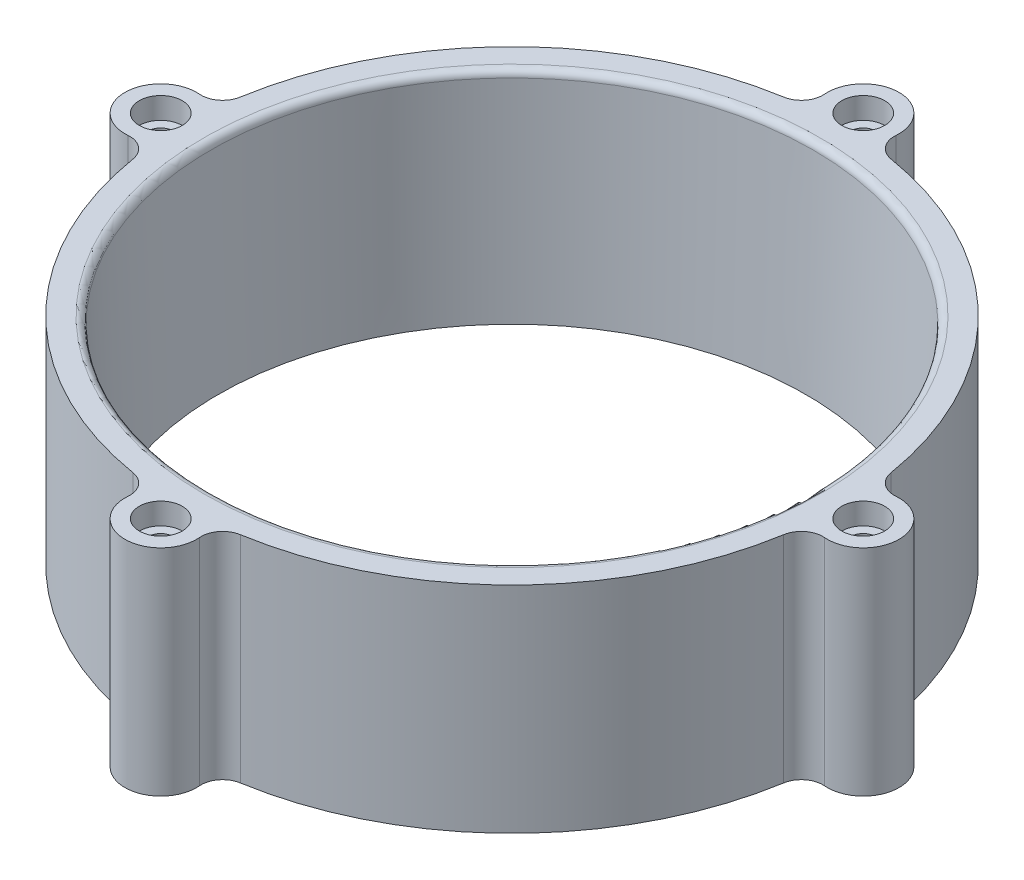
ISO-10303-21;
HEADER;
FILE_DESCRIPTION(('STEP AP214'),'2;1');
FILE_NAME('part.step','',(''),(''),'','','');
FILE_SCHEMA(('AUTOMOTIVE_DESIGN { 1 0 10303 214 1 1 1 1 }'));
ENDSEC;
DATA;
#1=APPLICATION_CONTEXT('core data for automotive mechanical design processes');
#2=APPLICATION_PROTOCOL_DEFINITION('international standard','automotive_design',2000,#1);
#3=PRODUCT_CONTEXT('',#1,'mechanical');
#4=PRODUCT('Part','Part','',(#3));
#5=PRODUCT_RELATED_PRODUCT_CATEGORY('part','',(#4));
#6=PRODUCT_DEFINITION_FORMATION('','',#4);
#7=PRODUCT_DEFINITION_CONTEXT('part definition',#1,'design');
#8=PRODUCT_DEFINITION('design','',#6,#7);
#9=PRODUCT_DEFINITION_SHAPE('','',#8);
#10=(LENGTH_UNIT() NAMED_UNIT(*) SI_UNIT(.MILLI.,.METRE.));
#11=(NAMED_UNIT(*) PLANE_ANGLE_UNIT() SI_UNIT($,.RADIAN.));
#12=(NAMED_UNIT(*) SI_UNIT($,.STERADIAN.) SOLID_ANGLE_UNIT());
#13=UNCERTAINTY_MEASURE_WITH_UNIT(LENGTH_MEASURE(1.E-05),#10,'distance_accuracy_value','');
#14=(GEOMETRIC_REPRESENTATION_CONTEXT(3) GLOBAL_UNCERTAINTY_ASSIGNED_CONTEXT((#13)) GLOBAL_UNIT_ASSIGNED_CONTEXT((#10,
#11,#12)) REPRESENTATION_CONTEXT('',''));
#15=CARTESIAN_POINT('',(0.,0.,0.));
#16=DIRECTION('',(0.,0.,1.));
#17=DIRECTION('',(1.,0.,0.));
#18=AXIS2_PLACEMENT_3D('',#15,#16,#17);
#19=CARTESIAN_POINT('',(0.,30.,-49.));
#20=DIRECTION('',(0.,-1.,0.));
#21=DIRECTION('',(0.,0.,-1.));
#22=AXIS2_PLACEMENT_3D('',#19,#20,#21);
#23=CYLINDRICAL_SURFACE('',#22,1.7);
#24=CARTESIAN_POINT('',(0.,0.,-49.));
#25=DIRECTION('',(0.,1.,0.));
#26=DIRECTION('',(0.,0.,1.));
#27=AXIS2_PLACEMENT_3D('',#24,#25,#26);
#28=CIRCLE('',#27,1.7);
#29=CARTESIAN_POINT('',(0.,0.,-47.3));
#30=VERTEX_POINT('',#29);
#31=EDGE_CURVE('E630',#30,#30,#28,.T.);
#32=ORIENTED_EDGE('',*,*,#31,.F.);
#33=EDGE_LOOP('',(#32));
#34=FACE_BOUND('',#33,.T.);
#35=CARTESIAN_POINT('',(0.,27.,-49.));
#36=DIRECTION('',(0.,1.,0.));
#37=DIRECTION('',(0.,0.,1.));
#38=AXIS2_PLACEMENT_3D('',#35,#36,#37);
#39=CIRCLE('',#38,1.7);
#40=CARTESIAN_POINT('',(0.,27.,-47.3));
#41=VERTEX_POINT('',#40);
#42=EDGE_CURVE('E268',#41,#41,#39,.T.);
#43=ORIENTED_EDGE('',*,*,#42,.T.);
#44=EDGE_LOOP('',(#43));
#45=FACE_BOUND('',#44,.T.);
#46=ADVANCED_FACE('F44',(#34,#45),#23,.F.);
#47=CARTESIAN_POINT('',(49.,30.,0.));
#48=DIRECTION('',(0.,-1.,0.));
#49=DIRECTION('',(0.,0.,-1.));
#50=AXIS2_PLACEMENT_3D('',#47,#48,#49);
#51=CYLINDRICAL_SURFACE('',#50,1.7);
#52=CARTESIAN_POINT('',(49.,0.,0.));
#53=DIRECTION('',(0.,1.,0.));
#54=DIRECTION('',(0.,0.,1.));
#55=AXIS2_PLACEMENT_3D('',#52,#53,#54);
#56=CIRCLE('',#55,1.7);
#57=CARTESIAN_POINT('',(49.,0.,1.70000000000002));
#58=VERTEX_POINT('',#57);
#59=EDGE_CURVE('E624',#58,#58,#56,.T.);
#60=ORIENTED_EDGE('',*,*,#59,.F.);
#61=EDGE_LOOP('',(#60));
#62=FACE_BOUND('',#61,.T.);
#63=CARTESIAN_POINT('',(49.,27.,0.));
#64=DIRECTION('',(0.,1.,0.));
#65=DIRECTION('',(0.,0.,1.));
#66=AXIS2_PLACEMENT_3D('',#63,#64,#65);
#67=CIRCLE('',#66,1.7);
#68=CARTESIAN_POINT('',(49.,27.,1.70000000000002));
#69=VERTEX_POINT('',#68);
#70=EDGE_CURVE('E266',#69,#69,#67,.T.);
#71=ORIENTED_EDGE('',*,*,#70,.T.);
#72=EDGE_LOOP('',(#71));
#73=FACE_BOUND('',#72,.T.);
#74=ADVANCED_FACE('F289',(#62,#73),#51,.F.);
#75=CARTESIAN_POINT('',(0.,30.,49.));
#76=DIRECTION('',(0.,-1.,0.));
#77=DIRECTION('',(0.,0.,-1.));
#78=AXIS2_PLACEMENT_3D('',#75,#76,#77);
#79=CYLINDRICAL_SURFACE('',#78,1.7);
#80=CARTESIAN_POINT('',(0.,0.,49.));
#81=DIRECTION('',(0.,1.,0.));
#82=DIRECTION('',(0.,0.,1.));
#83=AXIS2_PLACEMENT_3D('',#80,#81,#82);
#84=CIRCLE('',#83,1.7);
#85=CARTESIAN_POINT('',(0.,0.,50.7));
#86=VERTEX_POINT('',#85);
#87=EDGE_CURVE('E599',#86,#86,#84,.T.);
#88=ORIENTED_EDGE('',*,*,#87,.F.);
#89=EDGE_LOOP('',(#88));
#90=FACE_BOUND('',#89,.T.);
#91=CARTESIAN_POINT('',(0.,27.,49.));
#92=DIRECTION('',(0.,1.,0.));
#93=DIRECTION('',(0.,0.,1.));
#94=AXIS2_PLACEMENT_3D('',#91,#92,#93);
#95=CIRCLE('',#94,1.7);
#96=CARTESIAN_POINT('',(0.,27.,50.7));
#97=VERTEX_POINT('',#96);
#98=EDGE_CURVE('E264',#97,#97,#95,.T.);
#99=ORIENTED_EDGE('',*,*,#98,.T.);
#100=EDGE_LOOP('',(#99));
#101=FACE_BOUND('',#100,.T.);
#102=ADVANCED_FACE('F298',(#90,#101),#79,.F.);
#103=CARTESIAN_POINT('',(-49.,30.,0.));
#104=DIRECTION('',(0.,-1.,0.));
#105=DIRECTION('',(0.,0.,-1.));
#106=AXIS2_PLACEMENT_3D('',#103,#104,#105);
#107=CYLINDRICAL_SURFACE('',#106,1.7);
#108=CARTESIAN_POINT('',(-49.,0.,0.));
#109=DIRECTION('',(0.,1.,0.));
#110=DIRECTION('',(0.,0.,1.));
#111=AXIS2_PLACEMENT_3D('',#108,#109,#110);
#112=CIRCLE('',#111,1.7);
#113=CARTESIAN_POINT('',(-49.,0.,1.7));
#114=VERTEX_POINT('',#113);
#115=EDGE_CURVE('E619',#114,#114,#112,.T.);
#116=ORIENTED_EDGE('',*,*,#115,.F.);
#117=EDGE_LOOP('',(#116));
#118=FACE_BOUND('',#117,.T.);
#119=CARTESIAN_POINT('',(-49.,27.,0.));
#120=DIRECTION('',(0.,1.,0.));
#121=DIRECTION('',(0.,0.,1.));
#122=AXIS2_PLACEMENT_3D('',#119,#120,#121);
#123=CIRCLE('',#122,1.7);
#124=CARTESIAN_POINT('',(-49.,27.,1.7));
#125=VERTEX_POINT('',#124);
#126=EDGE_CURVE('E260',#125,#125,#123,.T.);
#127=ORIENTED_EDGE('',*,*,#126,.T.);
#128=EDGE_LOOP('',(#127));
#129=FACE_BOUND('',#128,.T.);
#130=ADVANCED_FACE('F306',(#118,#129),#107,.F.);
#131=CARTESIAN_POINT('',(0.,30.,24.5));
#132=DIRECTION('',(0.,1.,0.));
#133=DIRECTION('',(0.,0.,1.));
#134=AXIS2_PLACEMENT_3D('',#131,#132,#133);
#135=PLANE('',#134);
#136=CARTESIAN_POINT('',(0.,30.,0.));
#137=DIRECTION('',(0.,1.,0.));
#138=DIRECTION('',(0.,0.,1.));
#139=AXIS2_PLACEMENT_3D('',#136,#137,#138);
#140=CIRCLE('',#139,43.0133118595595);
#141=CARTESIAN_POINT('',(0.,30.,43.0133118595595));
#142=VERTEX_POINT('',#141);
#143=EDGE_CURVE('E11',#142,#142,#140,.F.);
#144=ORIENTED_EDGE('',*,*,#143,.T.);
#145=EDGE_LOOP('',(#144));
#146=FACE_BOUND('',#145,.T.);
#147=CARTESIAN_POINT('',(0.,30.,-49.));
#148=DIRECTION('',(0.,1.,0.));
#149=DIRECTION('',(0.,0.,1.));
#150=AXIS2_PLACEMENT_3D('',#147,#148,#149);
#151=CIRCLE('',#150,3.);
#152=CARTESIAN_POINT('',(0.,30.,-46.));
#153=VERTEX_POINT('',#152);
#154=EDGE_CURVE('E701',#153,#153,#151,.T.);
#155=ORIENTED_EDGE('',*,*,#154,.F.);
#156=EDGE_LOOP('',(#155));
#157=FACE_BOUND('',#156,.T.);
#158=CARTESIAN_POINT('',(-49.,30.,0.));
#159=DIRECTION('',(0.,1.,0.));
#160=DIRECTION('',(0.,0.,1.));
#161=AXIS2_PLACEMENT_3D('',#158,#159,#160);
#162=CIRCLE('',#161,3.);
#163=CARTESIAN_POINT('',(-49.,30.,3.));
#164=VERTEX_POINT('',#163);
#165=EDGE_CURVE('E697',#164,#164,#162,.T.);
#166=ORIENTED_EDGE('',*,*,#165,.F.);
#167=EDGE_LOOP('',(#166));
#168=FACE_BOUND('',#167,.T.);
#169=CARTESIAN_POINT('',(0.,30.,49.));
#170=DIRECTION('',(0.,1.,0.));
#171=DIRECTION('',(0.,0.,1.));
#172=AXIS2_PLACEMENT_3D('',#169,#170,#171);
#173=CIRCLE('',#172,3.);
#174=CARTESIAN_POINT('',(0.,30.,52.));
#175=VERTEX_POINT('',#174);
#176=EDGE_CURVE('E601',#175,#175,#173,.T.);
#177=ORIENTED_EDGE('',*,*,#176,.F.);
#178=EDGE_LOOP('',(#177));
#179=FACE_BOUND('',#178,.T.);
#180=CARTESIAN_POINT('',(49.,30.,0.));
#181=DIRECTION('',(0.,1.,0.));
#182=DIRECTION('',(0.,0.,1.));
#183=AXIS2_PLACEMENT_3D('',#180,#181,#182);
#184=CIRCLE('',#183,3.);
#185=CARTESIAN_POINT('',(49.,30.,3.00000000000002));
#186=VERTEX_POINT('',#185);
#187=EDGE_CURVE('E607',#186,#186,#184,.T.);
#188=ORIENTED_EDGE('',*,*,#187,.F.);
#189=EDGE_LOOP('',(#188));
#190=FACE_BOUND('',#189,.T.);
#191=CARTESIAN_POINT('',(-49.,30.,0.));
#192=DIRECTION('',(0.,1.,0.));
#193=DIRECTION('',(0.,0.,1.));
#194=AXIS2_PLACEMENT_3D('',#191,#192,#193);
#195=CIRCLE('',#194,5.);
#196=CARTESIAN_POINT('',(-48.5918367346939,30.,-4.98331242737746));
#197=VERTEX_POINT('',#196);
#198=CARTESIAN_POINT('',(-48.5918367346939,30.,4.98331242737746));
#199=VERTEX_POINT('',#198);
#200=EDGE_CURVE('E200',#197,#199,#195,.T.);
#201=ORIENTED_EDGE('',*,*,#200,.T.);
#202=CARTESIAN_POINT('',(-48.3469387755102,30.,7.97329988380398));
#203=DIRECTION('',(0.,1.,0.));
#204=DIRECTION('',(0.,0.,1.));
#205=AXIS2_PLACEMENT_3D('',#202,#203,#204);
#206=CIRCLE('',#205,3.);
#207=CARTESIAN_POINT('',(-45.3869221157851,30.,7.48513866642822));
#208=VERTEX_POINT('',#207);
#209=EDGE_CURVE('E232',#199,#208,#206,.F.);
#210=ORIENTED_EDGE('',*,*,#209,.T.);
#211=CARTESIAN_POINT('',(0.,30.,0.));
#212=DIRECTION('',(0.,1.,0.));
#213=DIRECTION('',(0.,0.,1.));
#214=AXIS2_PLACEMENT_3D('',#211,#212,#213);
#215=CIRCLE('',#214,46.);
#216=CARTESIAN_POINT('',(-7.48513866642817,30.,45.3869221157851));
#217=VERTEX_POINT('',#216);
#218=EDGE_CURVE('E194',#208,#217,#215,.T.);
#219=ORIENTED_EDGE('',*,*,#218,.T.);
#220=CARTESIAN_POINT('',(-7.97329988380392,30.,48.3469387755102));
#221=DIRECTION('',(0.,1.,0.));
#222=DIRECTION('',(0.,0.,1.));
#223=AXIS2_PLACEMENT_3D('',#220,#221,#222);
#224=CIRCLE('',#223,3.);
#225=CARTESIAN_POINT('',(-4.98331242737744,30.,48.5918367346939));
#226=VERTEX_POINT('',#225);
#227=EDGE_CURVE('E69',#217,#226,#224,.F.);
#228=ORIENTED_EDGE('',*,*,#227,.T.);
#229=CARTESIAN_POINT('',(0.,30.,49.));
#230=DIRECTION('',(0.,1.,0.));
#231=DIRECTION('',(0.,0.,1.));
#232=AXIS2_PLACEMENT_3D('',#229,#230,#231);
#233=CIRCLE('',#232,5.);
#234=CARTESIAN_POINT('',(4.98331242737748,30.,48.5918367346939));
#235=VERTEX_POINT('',#234);
#236=EDGE_CURVE('E635',#226,#235,#233,.T.);
#237=ORIENTED_EDGE('',*,*,#236,.T.);
#238=CARTESIAN_POINT('',(7.97329988380399,30.,48.3469387755102));
#239=DIRECTION('',(0.,1.,0.));
#240=DIRECTION('',(0.,0.,1.));
#241=AXIS2_PLACEMENT_3D('',#238,#239,#240);
#242=CIRCLE('',#241,3.);
#243=CARTESIAN_POINT('',(7.48513866642824,30.,45.3869221157851));
#244=VERTEX_POINT('',#243);
#245=EDGE_CURVE('E251',#235,#244,#242,.F.);
#246=ORIENTED_EDGE('',*,*,#245,.T.);
#247=CARTESIAN_POINT('',(0.,30.,0.));
#248=DIRECTION('',(0.,1.,0.));
#249=DIRECTION('',(0.,0.,1.));
#250=AXIS2_PLACEMENT_3D('',#247,#248,#249);
#251=CIRCLE('',#250,46.);
#252=CARTESIAN_POINT('',(45.3869221157851,30.,7.4851386664282));
#253=VERTEX_POINT('',#252);
#254=EDGE_CURVE('E632',#244,#253,#251,.T.);
#255=ORIENTED_EDGE('',*,*,#254,.T.);
#256=CARTESIAN_POINT('',(48.3469387755102,30.,7.97329988380396));
#257=DIRECTION('',(0.,1.,0.));
#258=DIRECTION('',(0.,0.,1.));
#259=AXIS2_PLACEMENT_3D('',#256,#257,#258);
#260=CIRCLE('',#259,3.);
#261=CARTESIAN_POINT('',(48.5918367346939,30.,4.98331242737748));
#262=VERTEX_POINT('',#261);
#263=EDGE_CURVE('E249',#253,#262,#260,.F.);
#264=ORIENTED_EDGE('',*,*,#263,.T.);
#265=CARTESIAN_POINT('',(49.,30.,0.));
#266=DIRECTION('',(0.,1.,0.));
#267=DIRECTION('',(0.,0.,1.));
#268=AXIS2_PLACEMENT_3D('',#265,#266,#267);
#269=CIRCLE('',#268,5.);
#270=CARTESIAN_POINT('',(48.5918367346939,30.,-4.98331242737744));
#271=VERTEX_POINT('',#270);
#272=EDGE_CURVE('E640',#262,#271,#269,.T.);
#273=ORIENTED_EDGE('',*,*,#272,.T.);
#274=CARTESIAN_POINT('',(48.3469387755102,30.,-7.97329988380396));
#275=DIRECTION('',(0.,1.,0.));
#276=DIRECTION('',(0.,0.,1.));
#277=AXIS2_PLACEMENT_3D('',#274,#275,#276);
#278=CIRCLE('',#277,3.);
#279=CARTESIAN_POINT('',(45.3869221157851,30.,-7.4851386664282));
#280=VERTEX_POINT('',#279);
#281=EDGE_CURVE('E246',#271,#280,#278,.F.);
#282=ORIENTED_EDGE('',*,*,#281,.T.);
#283=CARTESIAN_POINT('',(0.,30.,0.));
#284=DIRECTION('',(0.,1.,0.));
#285=DIRECTION('',(0.,0.,1.));
#286=AXIS2_PLACEMENT_3D('',#283,#284,#285);
#287=CIRCLE('',#286,46.);
#288=CARTESIAN_POINT('',(7.48513866642818,30.,-45.3869221157851));
#289=VERTEX_POINT('',#288);
#290=EDGE_CURVE('E639',#280,#289,#287,.T.);
#291=ORIENTED_EDGE('',*,*,#290,.T.);
#292=CARTESIAN_POINT('',(7.97329988380393,30.,-48.3469387755102));
#293=DIRECTION('',(0.,1.,0.));
#294=DIRECTION('',(0.,0.,1.));
#295=AXIS2_PLACEMENT_3D('',#292,#293,#294);
#296=CIRCLE('',#295,3.);
#297=CARTESIAN_POINT('',(4.98331242737746,30.,-48.5918367346939));
#298=VERTEX_POINT('',#297);
#299=EDGE_CURVE('E245',#289,#298,#296,.F.);
#300=ORIENTED_EDGE('',*,*,#299,.T.);
#301=CARTESIAN_POINT('',(0.,30.,-49.));
#302=DIRECTION('',(0.,1.,0.));
#303=DIRECTION('',(0.,0.,1.));
#304=AXIS2_PLACEMENT_3D('',#301,#302,#303);
#305=CIRCLE('',#304,5.);
#306=CARTESIAN_POINT('',(-4.98331242737746,30.,-48.5918367346939));
#307=VERTEX_POINT('',#306);
#308=EDGE_CURVE('E644',#298,#307,#305,.T.);
#309=ORIENTED_EDGE('',*,*,#308,.T.);
#310=CARTESIAN_POINT('',(-7.97329988380398,30.,-48.3469387755102));
#311=DIRECTION('',(0.,1.,0.));
#312=DIRECTION('',(0.,0.,1.));
#313=AXIS2_PLACEMENT_3D('',#310,#311,#312);
#314=CIRCLE('',#313,3.);
#315=CARTESIAN_POINT('',(-7.48513866642822,30.,-45.3869221157851));
#316=VERTEX_POINT('',#315);
#317=EDGE_CURVE('E167',#307,#316,#314,.F.);
#318=ORIENTED_EDGE('',*,*,#317,.T.);
#319=CARTESIAN_POINT('',(0.,30.,0.));
#320=DIRECTION('',(0.,1.,0.));
#321=DIRECTION('',(0.,0.,1.));
#322=AXIS2_PLACEMENT_3D('',#319,#320,#321);
#323=CIRCLE('',#322,46.);
#324=CARTESIAN_POINT('',(-45.3869221157851,30.,-7.48513866642818));
#325=VERTEX_POINT('',#324);
#326=EDGE_CURVE('E177',#316,#325,#323,.T.);
#327=ORIENTED_EDGE('',*,*,#326,.T.);
#328=CARTESIAN_POINT('',(-48.3469387755102,30.,-7.97329988380393));
#329=DIRECTION('',(0.,1.,0.));
#330=DIRECTION('',(0.,0.,1.));
#331=AXIS2_PLACEMENT_3D('',#328,#329,#330);
#332=CIRCLE('',#331,3.);
#333=EDGE_CURVE('E238',#325,#197,#332,.F.);
#334=ORIENTED_EDGE('',*,*,#333,.T.);
#335=EDGE_LOOP('',(#201,#210,#219,#228,#237,#246,#255,#264,#273,#282,#291,#300,#309,#318,#327,#334));
#336=FACE_BOUND('',#335,.T.);
#337=ADVANCED_FACE('F303',(#146,#157,#168,#179,#190,#336),#135,.T.);
#338=CARTESIAN_POINT('',(0.,0.,24.5));
#339=DIRECTION('',(0.,1.,0.));
#340=DIRECTION('',(0.,0.,1.));
#341=AXIS2_PLACEMENT_3D('',#338,#339,#340);
#342=PLANE('',#341);
#343=CARTESIAN_POINT('',(0.,0.,0.));
#344=DIRECTION('',(0.,1.,0.));
#345=DIRECTION('',(0.,0.,1.));
#346=AXIS2_PLACEMENT_3D('',#343,#344,#345);
#347=CIRCLE('',#346,46.);
#348=CARTESIAN_POINT('',(-45.3869221157851,0.,7.48513866642822));
#349=VERTEX_POINT('',#348);
#350=CARTESIAN_POINT('',(-7.48513866642817,0.,45.3869221157851));
#351=VERTEX_POINT('',#350);
#352=EDGE_CURVE('E629',#349,#351,#347,.T.);
#353=ORIENTED_EDGE('',*,*,#352,.F.);
#354=CARTESIAN_POINT('',(-48.3469387755102,0.,7.97329988380398));
#355=DIRECTION('',(0.,1.,0.));
#356=DIRECTION('',(0.,0.,1.));
#357=AXIS2_PLACEMENT_3D('',#354,#355,#356);
#358=CIRCLE('',#357,3.);
#359=CARTESIAN_POINT('',(-48.5918367346939,0.,4.98331242737746));
#360=VERTEX_POINT('',#359);
#361=EDGE_CURVE('E231',#349,#360,#358,.T.);
#362=ORIENTED_EDGE('',*,*,#361,.T.);
#363=CARTESIAN_POINT('',(-49.,0.,0.));
#364=DIRECTION('',(0.,1.,0.));
#365=DIRECTION('',(0.,0.,1.));
#366=AXIS2_PLACEMENT_3D('',#363,#364,#365);
#367=CIRCLE('',#366,5.);
#368=CARTESIAN_POINT('',(-48.5918367346939,0.,-4.98331242737746));
#369=VERTEX_POINT('',#368);
#370=EDGE_CURVE('E189',#369,#360,#367,.T.);
#371=ORIENTED_EDGE('',*,*,#370,.F.);
#372=CARTESIAN_POINT('',(-48.3469387755102,0.,-7.97329988380393));
#373=DIRECTION('',(0.,1.,0.));
#374=DIRECTION('',(0.,0.,1.));
#375=AXIS2_PLACEMENT_3D('',#372,#373,#374);
#376=CIRCLE('',#375,3.);
#377=CARTESIAN_POINT('',(-45.3869221157851,0.,-7.48513866642818));
#378=VERTEX_POINT('',#377);
#379=EDGE_CURVE('E190',#369,#378,#376,.T.);
#380=ORIENTED_EDGE('',*,*,#379,.T.);
#381=CARTESIAN_POINT('',(0.,0.,0.));
#382=DIRECTION('',(0.,1.,0.));
#383=DIRECTION('',(0.,0.,1.));
#384=AXIS2_PLACEMENT_3D('',#381,#382,#383);
#385=CIRCLE('',#384,46.);
#386=CARTESIAN_POINT('',(-7.48513866642822,0.,-45.3869221157851));
#387=VERTEX_POINT('',#386);
#388=EDGE_CURVE('E176',#387,#378,#385,.T.);
#389=ORIENTED_EDGE('',*,*,#388,.F.);
#390=CARTESIAN_POINT('',(-7.97329988380398,0.,-48.3469387755102));
#391=DIRECTION('',(0.,1.,0.));
#392=DIRECTION('',(0.,0.,1.));
#393=AXIS2_PLACEMENT_3D('',#390,#391,#392);
#394=CIRCLE('',#393,3.);
#395=CARTESIAN_POINT('',(-4.98331242737746,0.,-48.5918367346939));
#396=VERTEX_POINT('',#395);
#397=EDGE_CURVE('E159',#387,#396,#394,.T.);
#398=ORIENTED_EDGE('',*,*,#397,.T.);
#399=CARTESIAN_POINT('',(0.,0.,-49.));
#400=DIRECTION('',(0.,1.,0.));
#401=DIRECTION('',(0.,0.,1.));
#402=AXIS2_PLACEMENT_3D('',#399,#400,#401);
#403=CIRCLE('',#402,5.);
#404=CARTESIAN_POINT('',(4.98331242737746,0.,-48.5918367346939));
#405=VERTEX_POINT('',#404);
#406=EDGE_CURVE('E186',#405,#396,#403,.T.);
#407=ORIENTED_EDGE('',*,*,#406,.F.);
#408=CARTESIAN_POINT('',(7.97329988380393,0.,-48.3469387755102));
#409=DIRECTION('',(0.,1.,0.));
#410=DIRECTION('',(0.,0.,1.));
#411=AXIS2_PLACEMENT_3D('',#408,#409,#410);
#412=CIRCLE('',#411,3.);
#413=CARTESIAN_POINT('',(7.48513866642818,0.,-45.3869221157851));
#414=VERTEX_POINT('',#413);
#415=EDGE_CURVE('E239',#405,#414,#412,.T.);
#416=ORIENTED_EDGE('',*,*,#415,.T.);
#417=CARTESIAN_POINT('',(0.,0.,0.));
#418=DIRECTION('',(0.,1.,0.));
#419=DIRECTION('',(0.,0.,1.));
#420=AXIS2_PLACEMENT_3D('',#417,#418,#419);
#421=CIRCLE('',#420,46.);
#422=CARTESIAN_POINT('',(45.3869221157851,0.,-7.4851386664282));
#423=VERTEX_POINT('',#422);
#424=EDGE_CURVE('E195',#423,#414,#421,.T.);
#425=ORIENTED_EDGE('',*,*,#424,.F.);
#426=CARTESIAN_POINT('',(48.3469387755102,0.,-7.97329988380396));
#427=DIRECTION('',(0.,1.,0.));
#428=DIRECTION('',(0.,0.,1.));
#429=AXIS2_PLACEMENT_3D('',#426,#427,#428);
#430=CIRCLE('',#429,3.);
#431=CARTESIAN_POINT('',(48.5918367346939,0.,-4.98331242737744));
#432=VERTEX_POINT('',#431);
#433=EDGE_CURVE('E242',#423,#432,#430,.T.);
#434=ORIENTED_EDGE('',*,*,#433,.T.);
#435=CARTESIAN_POINT('',(49.,0.,0.));
#436=DIRECTION('',(0.,1.,0.));
#437=DIRECTION('',(0.,0.,1.));
#438=AXIS2_PLACEMENT_3D('',#435,#436,#437);
#439=CIRCLE('',#438,5.);
#440=CARTESIAN_POINT('',(48.5918367346939,0.,4.98331242737748));
#441=VERTEX_POINT('',#440);
#442=EDGE_CURVE('E656',#441,#432,#439,.T.);
#443=ORIENTED_EDGE('',*,*,#442,.F.);
#444=CARTESIAN_POINT('',(48.3469387755102,0.,7.97329988380396));
#445=DIRECTION('',(0.,1.,0.));
#446=DIRECTION('',(0.,0.,1.));
#447=AXIS2_PLACEMENT_3D('',#444,#445,#446);
#448=CIRCLE('',#447,3.);
#449=CARTESIAN_POINT('',(45.3869221157851,0.,7.4851386664282));
#450=VERTEX_POINT('',#449);
#451=EDGE_CURVE('E247',#441,#450,#448,.T.);
#452=ORIENTED_EDGE('',*,*,#451,.T.);
#453=CARTESIAN_POINT('',(0.,0.,0.));
#454=DIRECTION('',(0.,1.,0.));
#455=DIRECTION('',(0.,0.,1.));
#456=AXIS2_PLACEMENT_3D('',#453,#454,#455);
#457=CIRCLE('',#456,46.);
#458=CARTESIAN_POINT('',(7.48513866642824,0.,45.3869221157851));
#459=VERTEX_POINT('',#458);
#460=EDGE_CURVE('E655',#459,#450,#457,.T.);
#461=ORIENTED_EDGE('',*,*,#460,.F.);
#462=CARTESIAN_POINT('',(7.97329988380399,0.,48.3469387755102));
#463=DIRECTION('',(0.,1.,0.));
#464=DIRECTION('',(0.,0.,1.));
#465=AXIS2_PLACEMENT_3D('',#462,#463,#464);
#466=CIRCLE('',#465,3.);
#467=CARTESIAN_POINT('',(4.98331242737748,0.,48.5918367346939));
#468=VERTEX_POINT('',#467);
#469=EDGE_CURVE('E255',#459,#468,#466,.T.);
#470=ORIENTED_EDGE('',*,*,#469,.T.);
#471=CARTESIAN_POINT('',(0.,0.,49.));
#472=DIRECTION('',(0.,1.,0.));
#473=DIRECTION('',(0.,0.,1.));
#474=AXIS2_PLACEMENT_3D('',#471,#472,#473);
#475=CIRCLE('',#474,5.);
#476=CARTESIAN_POINT('',(-4.98331242737744,0.,48.5918367346939));
#477=VERTEX_POINT('',#476);
#478=EDGE_CURVE('E652',#477,#468,#475,.T.);
#479=ORIENTED_EDGE('',*,*,#478,.F.);
#480=CARTESIAN_POINT('',(-7.97329988380392,0.,48.3469387755102));
#481=DIRECTION('',(0.,1.,0.));
#482=DIRECTION('',(0.,0.,1.));
#483=AXIS2_PLACEMENT_3D('',#480,#481,#482);
#484=CIRCLE('',#483,3.);
#485=EDGE_CURVE('E258',#477,#351,#484,.T.);
#486=ORIENTED_EDGE('',*,*,#485,.T.);
#487=EDGE_LOOP('',(#353,#362,#371,#380,#389,#398,#407,#416,#425,#434,#443,#452,#461,#470,#479,#486));
#488=FACE_BOUND('',#487,.T.);
#489=ORIENTED_EDGE('',*,*,#31,.T.);
#490=EDGE_LOOP('',(#489));
#491=FACE_BOUND('',#490,.T.);
#492=ORIENTED_EDGE('',*,*,#59,.T.);
#493=EDGE_LOOP('',(#492));
#494=FACE_BOUND('',#493,.T.);
#495=ORIENTED_EDGE('',*,*,#87,.T.);
#496=EDGE_LOOP('',(#495));
#497=FACE_BOUND('',#496,.T.);
#498=ORIENTED_EDGE('',*,*,#115,.T.);
#499=EDGE_LOOP('',(#498));
#500=FACE_BOUND('',#499,.T.);
#501=CARTESIAN_POINT('',(0.,0.,0.));
#502=DIRECTION('',(0.,1.,0.));
#503=DIRECTION('',(0.,0.,1.));
#504=AXIS2_PLACEMENT_3D('',#501,#502,#503);
#505=CIRCLE('',#504,41.);
#506=CARTESIAN_POINT('',(0.,0.,41.));
#507=VERTEX_POINT('',#506);
#508=EDGE_CURVE('E272',#507,#507,#505,.T.);
#509=ORIENTED_EDGE('',*,*,#508,.T.);
#510=EDGE_LOOP('',(#509));
#511=FACE_BOUND('',#510,.T.);
#512=ADVANCED_FACE('F183',(#488,#491,#494,#497,#500,#511),#342,.F.);
#513=CARTESIAN_POINT('',(0.,30.,0.));
#514=DIRECTION('',(0.,-1.,0.));
#515=DIRECTION('',(0.,0.,-1.));
#516=AXIS2_PLACEMENT_3D('',#513,#514,#515);
#517=CYLINDRICAL_SURFACE('',#516,46.);
#518=ORIENTED_EDGE('',*,*,#218,.F.);
#519=DIRECTION('',(0.,-1.,0.));
#520=VECTOR('',#519,1.);
#521=CARTESIAN_POINT('',(-45.3869221157851,30.,7.48513866642822));
#522=LINE('',#521,#520);
#523=EDGE_CURVE('E204',#208,#349,#522,.T.);
#524=ORIENTED_EDGE('',*,*,#523,.T.);
#525=ORIENTED_EDGE('',*,*,#352,.T.);
#526=DIRECTION('',(0.,-1.,0.));
#527=VECTOR('',#526,1.);
#528=CARTESIAN_POINT('',(-7.48513866642817,30.,45.3869221157851));
#529=LINE('',#528,#527);
#530=EDGE_CURVE('E202',#351,#217,#529,.F.);
#531=ORIENTED_EDGE('',*,*,#530,.T.);
#532=EDGE_LOOP('',(#518,#524,#525,#531));
#533=FACE_BOUND('',#532,.T.);
#534=ADVANCED_FACE('F309',(#533),#517,.T.);
#535=CARTESIAN_POINT('',(0.,30.,49.));
#536=DIRECTION('',(0.,-1.,0.));
#537=DIRECTION('',(0.,0.,-1.));
#538=AXIS2_PLACEMENT_3D('',#535,#536,#537);
#539=CYLINDRICAL_SURFACE('',#538,5.);
#540=ORIENTED_EDGE('',*,*,#478,.T.);
#541=DIRECTION('',(0.,-1.,0.));
#542=VECTOR('',#541,1.);
#543=CARTESIAN_POINT('',(4.98331242737748,30.,48.5918367346939));
#544=LINE('',#543,#542);
#545=EDGE_CURVE('E58',#468,#235,#544,.F.);
#546=ORIENTED_EDGE('',*,*,#545,.T.);
#547=ORIENTED_EDGE('',*,*,#236,.F.);
#548=DIRECTION('',(0.,-1.,0.));
#549=VECTOR('',#548,1.);
#550=CARTESIAN_POINT('',(-4.98331242737744,30.,48.5918367346939));
#551=LINE('',#550,#549);
#552=EDGE_CURVE('E226',#226,#477,#551,.T.);
#553=ORIENTED_EDGE('',*,*,#552,.T.);
#554=EDGE_LOOP('',(#540,#546,#547,#553));
#555=FACE_BOUND('',#554,.T.);
#556=ADVANCED_FACE('F335',(#555),#539,.T.);
#557=CARTESIAN_POINT('',(0.,30.,0.));
#558=DIRECTION('',(0.,-1.,0.));
#559=DIRECTION('',(0.,0.,-1.));
#560=AXIS2_PLACEMENT_3D('',#557,#558,#559);
#561=CYLINDRICAL_SURFACE('',#560,46.);
#562=ORIENTED_EDGE('',*,*,#460,.T.);
#563=DIRECTION('',(0.,-1.,0.));
#564=VECTOR('',#563,1.);
#565=CARTESIAN_POINT('',(45.3869221157851,30.,7.4851386664282));
#566=LINE('',#565,#564);
#567=EDGE_CURVE('E228',#450,#253,#566,.F.);
#568=ORIENTED_EDGE('',*,*,#567,.T.);
#569=ORIENTED_EDGE('',*,*,#254,.F.);
#570=DIRECTION('',(0.,-1.,0.));
#571=VECTOR('',#570,1.);
#572=CARTESIAN_POINT('',(7.48513866642824,30.,45.3869221157851));
#573=LINE('',#572,#571);
#574=EDGE_CURVE('E222',#244,#459,#573,.T.);
#575=ORIENTED_EDGE('',*,*,#574,.T.);
#576=EDGE_LOOP('',(#562,#568,#569,#575));
#577=FACE_BOUND('',#576,.T.);
#578=ADVANCED_FACE('F330',(#577),#561,.T.);
#579=CARTESIAN_POINT('',(49.,30.,0.));
#580=DIRECTION('',(0.,-1.,0.));
#581=DIRECTION('',(0.,0.,-1.));
#582=AXIS2_PLACEMENT_3D('',#579,#580,#581);
#583=CYLINDRICAL_SURFACE('',#582,5.);
#584=ORIENTED_EDGE('',*,*,#442,.T.);
#585=DIRECTION('',(0.,-1.,0.));
#586=VECTOR('',#585,1.);
#587=CARTESIAN_POINT('',(48.5918367346939,30.,-4.98331242737744));
#588=LINE('',#587,#586);
#589=EDGE_CURVE('E221',#432,#271,#588,.F.);
#590=ORIENTED_EDGE('',*,*,#589,.T.);
#591=ORIENTED_EDGE('',*,*,#272,.F.);
#592=DIRECTION('',(0.,-1.,0.));
#593=VECTOR('',#592,1.);
#594=CARTESIAN_POINT('',(48.5918367346939,30.,4.98331242737748));
#595=LINE('',#594,#593);
#596=EDGE_CURVE('E220',#262,#441,#595,.T.);
#597=ORIENTED_EDGE('',*,*,#596,.T.);
#598=EDGE_LOOP('',(#584,#590,#591,#597));
#599=FACE_BOUND('',#598,.T.);
#600=ADVANCED_FACE('F325',(#599),#583,.T.);
#601=CARTESIAN_POINT('',(0.,30.,0.));
#602=DIRECTION('',(0.,-1.,0.));
#603=DIRECTION('',(0.,0.,-1.));
#604=AXIS2_PLACEMENT_3D('',#601,#602,#603);
#605=CYLINDRICAL_SURFACE('',#604,46.);
#606=ORIENTED_EDGE('',*,*,#424,.T.);
#607=DIRECTION('',(0.,-1.,0.));
#608=VECTOR('',#607,1.);
#609=CARTESIAN_POINT('',(7.48513866642818,30.,-45.3869221157851));
#610=LINE('',#609,#608);
#611=EDGE_CURVE('E217',#414,#289,#610,.F.);
#612=ORIENTED_EDGE('',*,*,#611,.T.);
#613=ORIENTED_EDGE('',*,*,#290,.F.);
#614=DIRECTION('',(0.,-1.,0.));
#615=VECTOR('',#614,1.);
#616=CARTESIAN_POINT('',(45.3869221157851,30.,-7.4851386664282));
#617=LINE('',#616,#615);
#618=EDGE_CURVE('E212',#280,#423,#617,.T.);
#619=ORIENTED_EDGE('',*,*,#618,.T.);
#620=EDGE_LOOP('',(#606,#612,#613,#619));
#621=FACE_BOUND('',#620,.T.);
#622=ADVANCED_FACE('F318',(#621),#605,.T.);
#623=CARTESIAN_POINT('',(0.,30.,-49.));
#624=DIRECTION('',(0.,-1.,0.));
#625=DIRECTION('',(0.,0.,-1.));
#626=AXIS2_PLACEMENT_3D('',#623,#624,#625);
#627=CYLINDRICAL_SURFACE('',#626,5.);
#628=ORIENTED_EDGE('',*,*,#406,.T.);
#629=DIRECTION('',(0.,-1.,0.));
#630=VECTOR('',#629,1.);
#631=CARTESIAN_POINT('',(-4.98331242737746,30.,-48.5918367346939));
#632=LINE('',#631,#630);
#633=EDGE_CURVE('E164',#396,#307,#632,.F.);
#634=ORIENTED_EDGE('',*,*,#633,.T.);
#635=ORIENTED_EDGE('',*,*,#308,.F.);
#636=DIRECTION('',(0.,-1.,0.));
#637=VECTOR('',#636,1.);
#638=CARTESIAN_POINT('',(4.98331242737746,30.,-48.5918367346939));
#639=LINE('',#638,#637);
#640=EDGE_CURVE('E179',#298,#405,#639,.T.);
#641=ORIENTED_EDGE('',*,*,#640,.T.);
#642=EDGE_LOOP('',(#628,#634,#635,#641));
#643=FACE_BOUND('',#642,.T.);
#644=ADVANCED_FACE('F320',(#643),#627,.T.);
#645=CARTESIAN_POINT('',(0.,30.,0.));
#646=DIRECTION('',(0.,-1.,0.));
#647=DIRECTION('',(0.,0.,-1.));
#648=AXIS2_PLACEMENT_3D('',#645,#646,#647);
#649=CYLINDRICAL_SURFACE('',#648,46.);
#650=ORIENTED_EDGE('',*,*,#326,.F.);
#651=DIRECTION('',(0.,-1.,0.));
#652=VECTOR('',#651,1.);
#653=CARTESIAN_POINT('',(-7.48513866642822,30.,-45.3869221157851));
#654=LINE('',#653,#652);
#655=EDGE_CURVE('E165',#316,#387,#654,.T.);
#656=ORIENTED_EDGE('',*,*,#655,.T.);
#657=ORIENTED_EDGE('',*,*,#388,.T.);
#658=DIRECTION('',(0.,-1.,0.));
#659=VECTOR('',#658,1.);
#660=CARTESIAN_POINT('',(-45.3869221157851,30.,-7.48513866642818));
#661=LINE('',#660,#659);
#662=EDGE_CURVE('E181',#378,#325,#661,.F.);
#663=ORIENTED_EDGE('',*,*,#662,.T.);
#664=EDGE_LOOP('',(#650,#656,#657,#663));
#665=FACE_BOUND('',#664,.T.);
#666=ADVANCED_FACE('F174',(#665),#649,.T.);
#667=CARTESIAN_POINT('',(-49.,30.,0.));
#668=DIRECTION('',(0.,-1.,0.));
#669=DIRECTION('',(0.,0.,-1.));
#670=AXIS2_PLACEMENT_3D('',#667,#668,#669);
#671=CYLINDRICAL_SURFACE('',#670,5.);
#672=ORIENTED_EDGE('',*,*,#370,.T.);
#673=DIRECTION('',(0.,-1.,0.));
#674=VECTOR('',#673,1.);
#675=CARTESIAN_POINT('',(-48.5918367346939,30.,4.98331242737746));
#676=LINE('',#675,#674);
#677=EDGE_CURVE('E213',#360,#199,#676,.F.);
#678=ORIENTED_EDGE('',*,*,#677,.T.);
#679=ORIENTED_EDGE('',*,*,#200,.F.);
#680=DIRECTION('',(0.,-1.,0.));
#681=VECTOR('',#680,1.);
#682=CARTESIAN_POINT('',(-48.5918367346939,30.,-4.98331242737746));
#683=LINE('',#682,#681);
#684=EDGE_CURVE('E206',#197,#369,#683,.T.);
#685=ORIENTED_EDGE('',*,*,#684,.T.);
#686=EDGE_LOOP('',(#672,#678,#679,#685));
#687=FACE_BOUND('',#686,.T.);
#688=ADVANCED_FACE('F311',(#687),#671,.T.);
#689=CARTESIAN_POINT('',(0.,0.,0.));
#690=DIRECTION('',(0.,1.,0.));
#691=DIRECTION('',(0.,0.,1.));
#692=AXIS2_PLACEMENT_3D('',#689,#690,#691);
#693=CONICAL_SURFACE('',#692,41.,0.0349065850398867);
#694=CARTESIAN_POINT('',(0.,29.0348994967025,0.));
#695=DIRECTION('',(0.,-1.,0.));
#696=DIRECTION('',(0.,0.,-1.));
#697=AXIS2_PLACEMENT_3D('',#694,#695,#696);
#698=CIRCLE('',#697,42.0139210325404);
#699=CARTESIAN_POINT('',(0.,29.0348994967025,-42.0139210325404));
#700=VERTEX_POINT('',#699);
#701=EDGE_CURVE('E52',#700,#700,#698,.F.);
#702=ORIENTED_EDGE('',*,*,#701,.T.);
#703=EDGE_LOOP('',(#702));
#704=FACE_BOUND('',#703,.T.);
#705=ORIENTED_EDGE('',*,*,#508,.F.);
#706=EDGE_LOOP('',(#705));
#707=FACE_BOUND('',#706,.T.);
#708=ADVANCED_FACE('F273',(#704,#707),#693,.F.);
#709=CARTESIAN_POINT('',(-7.97329988380398,30.,-48.3469387755102));
#710=DIRECTION('',(0.,1.,0.));
#711=DIRECTION('',(0.,0.,1.));
#712=AXIS2_PLACEMENT_3D('',#709,#710,#711);
#713=CYLINDRICAL_SURFACE('',#712,3.);
#714=ORIENTED_EDGE('',*,*,#317,.F.);
#715=ORIENTED_EDGE('',*,*,#633,.F.);
#716=ORIENTED_EDGE('',*,*,#397,.F.);
#717=ORIENTED_EDGE('',*,*,#655,.F.);
#718=EDGE_LOOP('',(#714,#715,#716,#717));
#719=FACE_BOUND('',#718,.T.);
#720=ADVANCED_FACE('F161',(#719),#713,.F.);
#721=CARTESIAN_POINT('',(-48.3469387755102,30.,7.97329988380398));
#722=DIRECTION('',(0.,1.,0.));
#723=DIRECTION('',(0.,0.,1.));
#724=AXIS2_PLACEMENT_3D('',#721,#722,#723);
#725=CYLINDRICAL_SURFACE('',#724,3.);
#726=ORIENTED_EDGE('',*,*,#209,.F.);
#727=ORIENTED_EDGE('',*,*,#677,.F.);
#728=ORIENTED_EDGE('',*,*,#361,.F.);
#729=ORIENTED_EDGE('',*,*,#523,.F.);
#730=EDGE_LOOP('',(#726,#727,#728,#729));
#731=FACE_BOUND('',#730,.T.);
#732=ADVANCED_FACE('F343',(#731),#725,.F.);
#733=CARTESIAN_POINT('',(-48.3469387755102,30.,-7.97329988380393));
#734=DIRECTION('',(0.,1.,0.));
#735=DIRECTION('',(0.,0.,1.));
#736=AXIS2_PLACEMENT_3D('',#733,#734,#735);
#737=CYLINDRICAL_SURFACE('',#736,3.);
#738=ORIENTED_EDGE('',*,*,#333,.F.);
#739=ORIENTED_EDGE('',*,*,#662,.F.);
#740=ORIENTED_EDGE('',*,*,#379,.F.);
#741=ORIENTED_EDGE('',*,*,#684,.F.);
#742=EDGE_LOOP('',(#738,#739,#740,#741));
#743=FACE_BOUND('',#742,.T.);
#744=ADVANCED_FACE('F345',(#743),#737,.F.);
#745=CARTESIAN_POINT('',(7.97329988380393,30.,-48.3469387755102));
#746=DIRECTION('',(0.,1.,0.));
#747=DIRECTION('',(0.,0.,1.));
#748=AXIS2_PLACEMENT_3D('',#745,#746,#747);
#749=CYLINDRICAL_SURFACE('',#748,3.);
#750=ORIENTED_EDGE('',*,*,#299,.F.);
#751=ORIENTED_EDGE('',*,*,#611,.F.);
#752=ORIENTED_EDGE('',*,*,#415,.F.);
#753=ORIENTED_EDGE('',*,*,#640,.F.);
#754=EDGE_LOOP('',(#750,#751,#752,#753));
#755=FACE_BOUND('',#754,.T.);
#756=ADVANCED_FACE('F350',(#755),#749,.F.);
#757=CARTESIAN_POINT('',(48.3469387755102,30.,-7.97329988380396));
#758=DIRECTION('',(0.,1.,0.));
#759=DIRECTION('',(0.,0.,1.));
#760=AXIS2_PLACEMENT_3D('',#757,#758,#759);
#761=CYLINDRICAL_SURFACE('',#760,3.);
#762=ORIENTED_EDGE('',*,*,#281,.F.);
#763=ORIENTED_EDGE('',*,*,#589,.F.);
#764=ORIENTED_EDGE('',*,*,#433,.F.);
#765=ORIENTED_EDGE('',*,*,#618,.F.);
#766=EDGE_LOOP('',(#762,#763,#764,#765));
#767=FACE_BOUND('',#766,.T.);
#768=ADVANCED_FACE('F355',(#767),#761,.F.);
#769=CARTESIAN_POINT('',(48.3469387755102,30.,7.97329988380396));
#770=DIRECTION('',(0.,1.,0.));
#771=DIRECTION('',(0.,0.,1.));
#772=AXIS2_PLACEMENT_3D('',#769,#770,#771);
#773=CYLINDRICAL_SURFACE('',#772,3.);
#774=ORIENTED_EDGE('',*,*,#263,.F.);
#775=ORIENTED_EDGE('',*,*,#567,.F.);
#776=ORIENTED_EDGE('',*,*,#451,.F.);
#777=ORIENTED_EDGE('',*,*,#596,.F.);
#778=EDGE_LOOP('',(#774,#775,#776,#777));
#779=FACE_BOUND('',#778,.T.);
#780=ADVANCED_FACE('F358',(#779),#773,.F.);
#781=CARTESIAN_POINT('',(7.97329988380399,30.,48.3469387755102));
#782=DIRECTION('',(0.,1.,0.));
#783=DIRECTION('',(0.,0.,1.));
#784=AXIS2_PLACEMENT_3D('',#781,#782,#783);
#785=CYLINDRICAL_SURFACE('',#784,3.);
#786=ORIENTED_EDGE('',*,*,#245,.F.);
#787=ORIENTED_EDGE('',*,*,#545,.F.);
#788=ORIENTED_EDGE('',*,*,#469,.F.);
#789=ORIENTED_EDGE('',*,*,#574,.F.);
#790=EDGE_LOOP('',(#786,#787,#788,#789));
#791=FACE_BOUND('',#790,.T.);
#792=ADVANCED_FACE('F359',(#791),#785,.F.);
#793=CARTESIAN_POINT('',(-7.97329988380392,30.,48.3469387755102));
#794=DIRECTION('',(0.,1.,0.));
#795=DIRECTION('',(0.,0.,1.));
#796=AXIS2_PLACEMENT_3D('',#793,#794,#795);
#797=CYLINDRICAL_SURFACE('',#796,3.);
#798=ORIENTED_EDGE('',*,*,#227,.F.);
#799=ORIENTED_EDGE('',*,*,#530,.F.);
#800=ORIENTED_EDGE('',*,*,#485,.F.);
#801=ORIENTED_EDGE('',*,*,#552,.F.);
#802=EDGE_LOOP('',(#798,#799,#800,#801));
#803=FACE_BOUND('',#802,.T.);
#804=ADVANCED_FACE('F364',(#803),#797,.F.);
#805=CARTESIAN_POINT('',(-49.,27.,0.));
#806=DIRECTION('',(0.,1.,0.));
#807=DIRECTION('',(0.,0.,1.));
#808=AXIS2_PLACEMENT_3D('',#805,#806,#807);
#809=CYLINDRICAL_SURFACE('',#808,3.);
#810=CARTESIAN_POINT('',(-49.,27.,0.));
#811=DIRECTION('',(0.,1.,0.));
#812=DIRECTION('',(0.,0.,1.));
#813=AXIS2_PLACEMENT_3D('',#810,#811,#812);
#814=CIRCLE('',#813,3.);
#815=CARTESIAN_POINT('',(-49.,27.,3.));
#816=VERTEX_POINT('',#815);
#817=EDGE_CURVE('E606',#816,#816,#814,.T.);
#818=ORIENTED_EDGE('',*,*,#817,.F.);
#819=EDGE_LOOP('',(#818));
#820=FACE_BOUND('',#819,.T.);
#821=ORIENTED_EDGE('',*,*,#165,.T.);
#822=EDGE_LOOP('',(#821));
#823=FACE_BOUND('',#822,.T.);
#824=ADVANCED_FACE('F370',(#820,#823),#809,.F.);
#825=CARTESIAN_POINT('',(-49.,27.,0.));
#826=DIRECTION('',(0.,1.,0.));
#827=DIRECTION('',(0.,0.,1.));
#828=AXIS2_PLACEMENT_3D('',#825,#826,#827);
#829=PLANE('',#828);
#830=ORIENTED_EDGE('',*,*,#126,.F.);
#831=EDGE_LOOP('',(#830));
#832=FACE_BOUND('',#831,.T.);
#833=ORIENTED_EDGE('',*,*,#817,.T.);
#834=EDGE_LOOP('',(#833));
#835=FACE_BOUND('',#834,.T.);
#836=ADVANCED_FACE('F430',(#832,#835),#829,.T.);
#837=CARTESIAN_POINT('',(0.,27.,49.));
#838=DIRECTION('',(0.,1.,0.));
#839=DIRECTION('',(0.,0.,1.));
#840=AXIS2_PLACEMENT_3D('',#837,#838,#839);
#841=CYLINDRICAL_SURFACE('',#840,3.);
#842=CARTESIAN_POINT('',(0.,27.,49.));
#843=DIRECTION('',(0.,1.,0.));
#844=DIRECTION('',(0.,0.,1.));
#845=AXIS2_PLACEMENT_3D('',#842,#843,#844);
#846=CIRCLE('',#845,3.);
#847=CARTESIAN_POINT('',(0.,27.,52.));
#848=VERTEX_POINT('',#847);
#849=EDGE_CURVE('E605',#848,#848,#846,.T.);
#850=ORIENTED_EDGE('',*,*,#849,.F.);
#851=EDGE_LOOP('',(#850));
#852=FACE_BOUND('',#851,.T.);
#853=ORIENTED_EDGE('',*,*,#176,.T.);
#854=EDGE_LOOP('',(#853));
#855=FACE_BOUND('',#854,.T.);
#856=ADVANCED_FACE('F417',(#852,#855),#841,.F.);
#857=CARTESIAN_POINT('',(0.,27.,49.));
#858=DIRECTION('',(0.,1.,0.));
#859=DIRECTION('',(0.,0.,1.));
#860=AXIS2_PLACEMENT_3D('',#857,#858,#859);
#861=PLANE('',#860);
#862=ORIENTED_EDGE('',*,*,#98,.F.);
#863=EDGE_LOOP('',(#862));
#864=FACE_BOUND('',#863,.T.);
#865=ORIENTED_EDGE('',*,*,#849,.T.);
#866=EDGE_LOOP('',(#865));
#867=FACE_BOUND('',#866,.T.);
#868=ADVANCED_FACE('F410',(#864,#867),#861,.T.);
#869=CARTESIAN_POINT('',(49.,27.,0.));
#870=DIRECTION('',(0.,1.,0.));
#871=DIRECTION('',(0.,0.,1.));
#872=AXIS2_PLACEMENT_3D('',#869,#870,#871);
#873=CYLINDRICAL_SURFACE('',#872,3.);
#874=CARTESIAN_POINT('',(49.,27.,0.));
#875=DIRECTION('',(0.,1.,0.));
#876=DIRECTION('',(0.,0.,1.));
#877=AXIS2_PLACEMENT_3D('',#874,#875,#876);
#878=CIRCLE('',#877,3.);
#879=CARTESIAN_POINT('',(49.,27.,3.00000000000002));
#880=VERTEX_POINT('',#879);
#881=EDGE_CURVE('E615',#880,#880,#878,.T.);
#882=ORIENTED_EDGE('',*,*,#881,.F.);
#883=EDGE_LOOP('',(#882));
#884=FACE_BOUND('',#883,.T.);
#885=ORIENTED_EDGE('',*,*,#187,.T.);
#886=EDGE_LOOP('',(#885));
#887=FACE_BOUND('',#886,.T.);
#888=ADVANCED_FACE('F399',(#884,#887),#873,.F.);
#889=CARTESIAN_POINT('',(49.,27.,0.));
#890=DIRECTION('',(0.,1.,0.));
#891=DIRECTION('',(0.,0.,1.));
#892=AXIS2_PLACEMENT_3D('',#889,#890,#891);
#893=PLANE('',#892);
#894=ORIENTED_EDGE('',*,*,#70,.F.);
#895=EDGE_LOOP('',(#894));
#896=FACE_BOUND('',#895,.T.);
#897=ORIENTED_EDGE('',*,*,#881,.T.);
#898=EDGE_LOOP('',(#897));
#899=FACE_BOUND('',#898,.T.);
#900=ADVANCED_FACE('F392',(#896,#899),#893,.T.);
#901=CARTESIAN_POINT('',(0.,27.,-49.));
#902=DIRECTION('',(0.,1.,0.));
#903=DIRECTION('',(0.,0.,1.));
#904=AXIS2_PLACEMENT_3D('',#901,#902,#903);
#905=CYLINDRICAL_SURFACE('',#904,3.);
#906=CARTESIAN_POINT('',(0.,27.,-49.));
#907=DIRECTION('',(0.,1.,0.));
#908=DIRECTION('',(0.,0.,1.));
#909=AXIS2_PLACEMENT_3D('',#906,#907,#908);
#910=CIRCLE('',#909,3.);
#911=CARTESIAN_POINT('',(0.,27.,-46.));
#912=VERTEX_POINT('',#911);
#913=EDGE_CURVE('E265',#912,#912,#910,.T.);
#914=ORIENTED_EDGE('',*,*,#913,.F.);
#915=EDGE_LOOP('',(#914));
#916=FACE_BOUND('',#915,.T.);
#917=ORIENTED_EDGE('',*,*,#154,.T.);
#918=EDGE_LOOP('',(#917));
#919=FACE_BOUND('',#918,.T.);
#920=ADVANCED_FACE('F283',(#916,#919),#905,.F.);
#921=CARTESIAN_POINT('',(0.,27.,-49.));
#922=DIRECTION('',(0.,1.,0.));
#923=DIRECTION('',(0.,0.,1.));
#924=AXIS2_PLACEMENT_3D('',#921,#922,#923);
#925=PLANE('',#924);
#926=ORIENTED_EDGE('',*,*,#42,.F.);
#927=EDGE_LOOP('',(#926));
#928=FACE_BOUND('',#927,.T.);
#929=ORIENTED_EDGE('',*,*,#913,.T.);
#930=EDGE_LOOP('',(#929));
#931=FACE_BOUND('',#930,.T.);
#932=ADVANCED_FACE('F280',(#928,#931),#925,.T.);
#933=CARTESIAN_POINT('',(0.,29.,0.));
#934=DIRECTION('',(0.,1.,0.));
#935=DIRECTION('',(0.,0.,1.));
#936=AXIS2_PLACEMENT_3D('',#933,#934,#935);
#937=TOROIDAL_SURFACE('',#936,43.0133118595595,1.);
#938=ORIENTED_EDGE('',*,*,#143,.F.);
#939=EDGE_LOOP('',(#938));
#940=FACE_BOUND('',#939,.T.);
#941=ORIENTED_EDGE('',*,*,#701,.F.);
#942=EDGE_LOOP('',(#941));
#943=FACE_BOUND('',#942,.T.);
#944=ADVANCED_FACE('F50',(#940,#943),#937,.T.);
#945=CLOSED_SHELL('',(#46,#74,#102,#130,#337,#512,#534,#556,#578,#600,#622,#644,#666,#688,#708,
#720,#732,#744,#756,#768,#780,#792,#804,#824,#836,#856,#868,#888,#900,#920,#932,#944));
#946=MANIFOLD_SOLID_BREP('B2',#945);
#947=ADVANCED_BREP_SHAPE_REPRESENTATION('',(#18,#946),#14);
#948=SHAPE_DEFINITION_REPRESENTATION(#9,#947);
ENDSEC;
END-ISO-10303-21;
